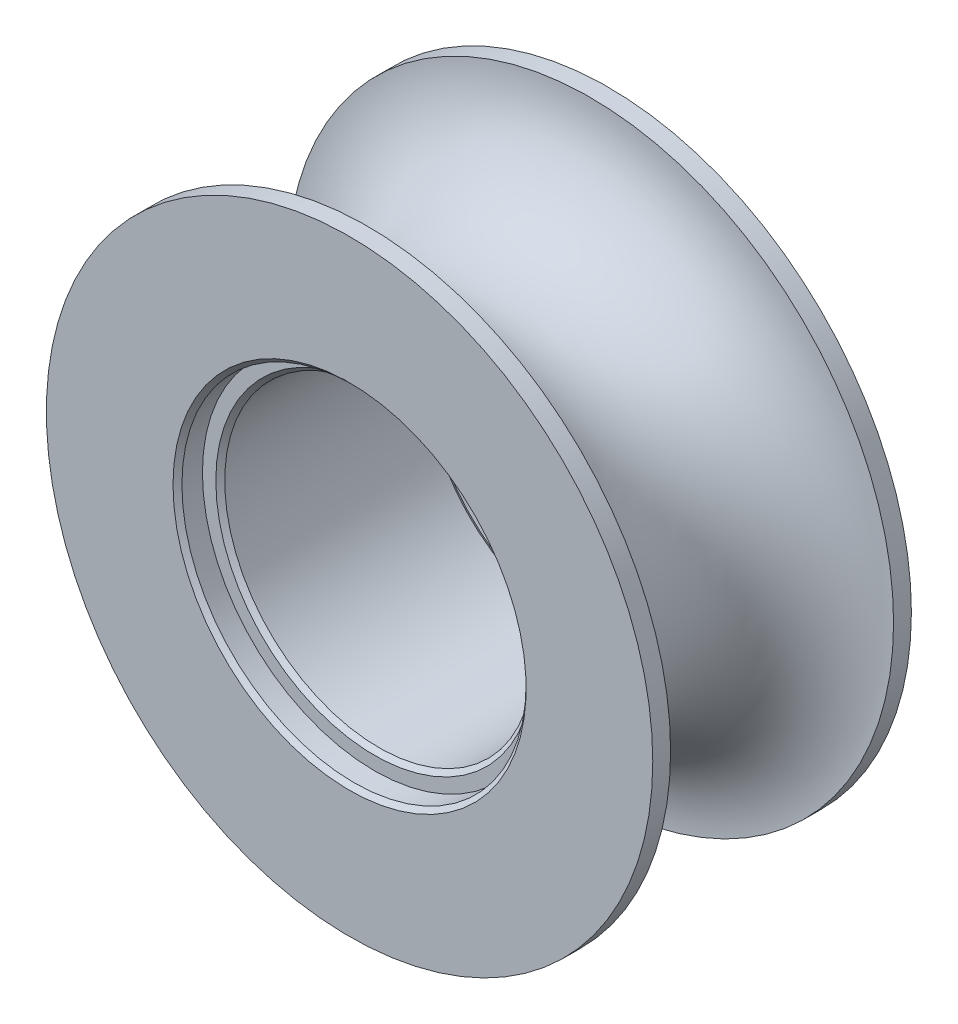
ISO-10303-21;
HEADER;
FILE_DESCRIPTION(('STEP AP214'),'2;1');
FILE_NAME('part.step','',(''),(''),'','','');
FILE_SCHEMA(('AUTOMOTIVE_DESIGN { 1 0 10303 214 1 1 1 1 }'));
ENDSEC;
DATA;
#1=APPLICATION_CONTEXT('core data for automotive mechanical design processes');
#2=APPLICATION_PROTOCOL_DEFINITION('international standard','automotive_design',2000,#1);
#3=PRODUCT_CONTEXT('',#1,'mechanical');
#4=PRODUCT('Part','Part','',(#3));
#5=PRODUCT_RELATED_PRODUCT_CATEGORY('part','',(#4));
#6=PRODUCT_DEFINITION_FORMATION('','',#4);
#7=PRODUCT_DEFINITION_CONTEXT('part definition',#1,'design');
#8=PRODUCT_DEFINITION('design','',#6,#7);
#9=PRODUCT_DEFINITION_SHAPE('','',#8);
#10=(LENGTH_UNIT() NAMED_UNIT(*) SI_UNIT(.MILLI.,.METRE.));
#11=(NAMED_UNIT(*) PLANE_ANGLE_UNIT() SI_UNIT($,.RADIAN.));
#12=(NAMED_UNIT(*) SI_UNIT($,.STERADIAN.) SOLID_ANGLE_UNIT());
#13=UNCERTAINTY_MEASURE_WITH_UNIT(LENGTH_MEASURE(1.E-05),#10,'distance_accuracy_value','');
#14=(GEOMETRIC_REPRESENTATION_CONTEXT(3) GLOBAL_UNCERTAINTY_ASSIGNED_CONTEXT((#13)) GLOBAL_UNIT_ASSIGNED_CONTEXT((#10,
#11,#12)) REPRESENTATION_CONTEXT('',''));
#15=CARTESIAN_POINT('',(0.,0.,0.));
#16=DIRECTION('',(0.,0.,1.));
#17=DIRECTION('',(1.,0.,0.));
#18=AXIS2_PLACEMENT_3D('',#15,#16,#17);
#19=CARTESIAN_POINT('',(0.,0.,64.9809529823271));
#20=DIRECTION('',(0.,0.,1.));
#21=DIRECTION('',(1.,0.,0.));
#22=AXIS2_PLACEMENT_3D('',#19,#20,#21);
#23=CYLINDRICAL_SURFACE('',#22,8.65);
#24=CARTESIAN_POINT('',(0.,0.,5.59999999999999));
#25=DIRECTION('',(0.,0.,1.));
#26=DIRECTION('',(1.,0.,0.));
#27=AXIS2_PLACEMENT_3D('',#24,#25,#26);
#28=CIRCLE('',#27,8.65);
#29=CARTESIAN_POINT('',(8.65,0.,5.59999999999999));
#30=VERTEX_POINT('',#29);
#31=EDGE_CURVE('E58',#30,#30,#28,.T.);
#32=ORIENTED_EDGE('',*,*,#31,.T.);
#33=EDGE_LOOP('',(#32));
#34=FACE_BOUND('',#33,.T.);
#35=CARTESIAN_POINT('',(0.,0.,-5.60000000000001));
#36=DIRECTION('',(0.,0.,-1.));
#37=DIRECTION('',(-1.,0.,0.));
#38=AXIS2_PLACEMENT_3D('',#35,#36,#37);
#39=CIRCLE('',#38,8.65);
#40=CARTESIAN_POINT('',(-8.65,0.,-5.60000000000001));
#41=VERTEX_POINT('',#40);
#42=EDGE_CURVE('E64',#41,#41,#39,.T.);
#43=ORIENTED_EDGE('',*,*,#42,.T.);
#44=EDGE_LOOP('',(#43));
#45=FACE_BOUND('',#44,.T.);
#46=ADVANCED_FACE('F39',(#34,#45),#23,.F.);
#47=CARTESIAN_POINT('',(0.,0.,0.));
#48=DIRECTION('',(0.,0.,1.));
#49=DIRECTION('',(1.,0.,0.));
#50=AXIS2_PLACEMENT_3D('',#47,#48,#49);
#51=TOROIDAL_SURFACE('',#50,17.,6.25);
#52=CARTESIAN_POINT('',(0.,0.,6.24999999999999));
#53=DIRECTION('',(0.,0.,1.));
#54=DIRECTION('',(1.,0.,0.));
#55=AXIS2_PLACEMENT_3D('',#52,#53,#54);
#56=CIRCLE('',#55,17.);
#57=CARTESIAN_POINT('',(17.,0.,6.24999999999999));
#58=VERTEX_POINT('',#57);
#59=EDGE_CURVE('E80',#58,#58,#56,.T.);
#60=ORIENTED_EDGE('',*,*,#59,.F.);
#61=EDGE_LOOP('',(#60));
#62=FACE_BOUND('',#61,.T.);
#63=CARTESIAN_POINT('',(0.,0.,-6.25000000000001));
#64=DIRECTION('',(0.,0.,1.));
#65=DIRECTION('',(1.,0.,0.));
#66=AXIS2_PLACEMENT_3D('',#63,#64,#65);
#67=CIRCLE('',#66,17.);
#68=CARTESIAN_POINT('',(17.,0.,-6.25000000000001));
#69=VERTEX_POINT('',#68);
#70=EDGE_CURVE('E92',#69,#69,#67,.T.);
#71=ORIENTED_EDGE('',*,*,#70,.T.);
#72=EDGE_LOOP('',(#71));
#73=FACE_BOUND('',#72,.T.);
#74=ADVANCED_FACE('F124',(#62,#73),#51,.F.);
#75=CARTESIAN_POINT('',(0.,0.,64.9809529823271));
#76=DIRECTION('',(0.,0.,1.));
#77=DIRECTION('',(1.,0.,0.));
#78=AXIS2_PLACEMENT_3D('',#75,#76,#77);
#79=CYLINDRICAL_SURFACE('',#78,17.);
#80=CARTESIAN_POINT('',(0.,0.,7.24999999999999));
#81=DIRECTION('',(0.,0.,1.));
#82=DIRECTION('',(1.,0.,0.));
#83=AXIS2_PLACEMENT_3D('',#80,#81,#82);
#84=CIRCLE('',#83,17.);
#85=CARTESIAN_POINT('',(17.,0.,7.24999999999999));
#86=VERTEX_POINT('',#85);
#87=EDGE_CURVE('E84',#86,#86,#84,.T.);
#88=ORIENTED_EDGE('',*,*,#87,.F.);
#89=EDGE_LOOP('',(#88));
#90=FACE_BOUND('',#89,.T.);
#91=ORIENTED_EDGE('',*,*,#59,.T.);
#92=EDGE_LOOP('',(#91));
#93=FACE_BOUND('',#92,.T.);
#94=ADVANCED_FACE('F130',(#90,#93),#79,.T.);
#95=CARTESIAN_POINT('',(0.,17.,7.24999999999999));
#96=DIRECTION('',(0.,0.,-1.));
#97=DIRECTION('',(-1.,0.,0.));
#98=AXIS2_PLACEMENT_3D('',#95,#96,#97);
#99=PLANE('',#98);
#100=CARTESIAN_POINT('',(0.,0.,7.24999999999999));
#101=DIRECTION('',(0.,0.,-1.));
#102=DIRECTION('',(-1.,0.,0.));
#103=AXIS2_PLACEMENT_3D('',#100,#101,#102);
#104=CIRCLE('',#103,9.90000000000001);
#105=CARTESIAN_POINT('',(-9.90000000000001,0.,7.24999999999999));
#106=VERTEX_POINT('',#105);
#107=EDGE_CURVE('E72',#106,#106,#104,.T.);
#108=ORIENTED_EDGE('',*,*,#107,.T.);
#109=EDGE_LOOP('',(#108));
#110=FACE_BOUND('',#109,.T.);
#111=ORIENTED_EDGE('',*,*,#87,.T.);
#112=EDGE_LOOP('',(#111));
#113=FACE_BOUND('',#112,.T.);
#114=ADVANCED_FACE('F138',(#110,#113),#99,.F.);
#115=CARTESIAN_POINT('',(0.,17.,-7.25000000000001));
#116=DIRECTION('',(0.,0.,1.));
#117=DIRECTION('',(1.,0.,0.));
#118=AXIS2_PLACEMENT_3D('',#115,#116,#117);
#119=PLANE('',#118);
#120=CARTESIAN_POINT('',(0.,0.,-7.25000000000001));
#121=DIRECTION('',(0.,0.,1.));
#122=DIRECTION('',(1.,0.,0.));
#123=AXIS2_PLACEMENT_3D('',#120,#121,#122);
#124=CIRCLE('',#123,9.90000000000001);
#125=CARTESIAN_POINT('',(9.90000000000001,0.,-7.25000000000001));
#126=VERTEX_POINT('',#125);
#127=EDGE_CURVE('E48',#126,#126,#124,.T.);
#128=ORIENTED_EDGE('',*,*,#127,.T.);
#129=EDGE_LOOP('',(#128));
#130=FACE_BOUND('',#129,.T.);
#131=CARTESIAN_POINT('',(0.,0.,-7.25000000000001));
#132=DIRECTION('',(0.,0.,1.));
#133=DIRECTION('',(1.,0.,0.));
#134=AXIS2_PLACEMENT_3D('',#131,#132,#133);
#135=CIRCLE('',#134,17.);
#136=CARTESIAN_POINT('',(17.,0.,-7.25000000000001));
#137=VERTEX_POINT('',#136);
#138=EDGE_CURVE('E88',#137,#137,#135,.T.);
#139=ORIENTED_EDGE('',*,*,#138,.F.);
#140=EDGE_LOOP('',(#139));
#141=FACE_BOUND('',#140,.T.);
#142=ADVANCED_FACE('F136',(#130,#141),#119,.F.);
#143=CARTESIAN_POINT('',(0.,0.,64.9809529823271));
#144=DIRECTION('',(0.,0.,1.));
#145=DIRECTION('',(1.,0.,0.));
#146=AXIS2_PLACEMENT_3D('',#143,#144,#145);
#147=CYLINDRICAL_SURFACE('',#146,17.);
#148=ORIENTED_EDGE('',*,*,#70,.F.);
#149=EDGE_LOOP('',(#148));
#150=FACE_BOUND('',#149,.T.);
#151=ORIENTED_EDGE('',*,*,#138,.T.);
#152=EDGE_LOOP('',(#151));
#153=FACE_BOUND('',#152,.T.);
#154=ADVANCED_FACE('F173',(#150,#153),#147,.T.);
#155=CARTESIAN_POINT('',(0.,0.,-5.85));
#156=DIRECTION('',(0.,0.,-1.));
#157=DIRECTION('',(-1.,0.,0.));
#158=AXIS2_PLACEMENT_3D('',#155,#156,#157);
#159=PLANE('',#158);
#160=CARTESIAN_POINT('',(0.,0.,-5.85));
#161=DIRECTION('',(0.,0.,-1.));
#162=DIRECTION('',(-1.,0.,0.));
#163=AXIS2_PLACEMENT_3D('',#160,#161,#162);
#164=CIRCLE('',#163,8.89999999999999);
#165=CARTESIAN_POINT('',(-8.89999999999999,0.,-5.85));
#166=VERTEX_POINT('',#165);
#167=EDGE_CURVE('E10',#166,#166,#164,.F.);
#168=ORIENTED_EDGE('',*,*,#167,.T.);
#169=EDGE_LOOP('',(#168));
#170=FACE_BOUND('',#169,.T.);
#171=CARTESIAN_POINT('',(0.,0.,-5.85));
#172=DIRECTION('',(0.,0.,-1.));
#173=DIRECTION('',(-1.,0.,0.));
#174=AXIS2_PLACEMENT_3D('',#171,#172,#173);
#175=CIRCLE('',#174,9.65);
#176=CARTESIAN_POINT('',(-9.65,0.,-5.85));
#177=VERTEX_POINT('',#176);
#178=EDGE_CURVE('E96',#177,#177,#175,.T.);
#179=ORIENTED_EDGE('',*,*,#178,.T.);
#180=EDGE_LOOP('',(#179));
#181=FACE_BOUND('',#180,.T.);
#182=ADVANCED_FACE('F168',(#170,#181),#159,.T.);
#183=CARTESIAN_POINT('',(0.,0.,-5.85));
#184=DIRECTION('',(0.,0.,-1.));
#185=DIRECTION('',(-1.,0.,0.));
#186=AXIS2_PLACEMENT_3D('',#183,#184,#185);
#187=CYLINDRICAL_SURFACE('',#186,9.65);
#188=CARTESIAN_POINT('',(0.,0.,-6.99999999999999));
#189=DIRECTION('',(0.,0.,1.));
#190=DIRECTION('',(1.,0.,0.));
#191=AXIS2_PLACEMENT_3D('',#188,#189,#190);
#192=CIRCLE('',#191,9.65);
#193=CARTESIAN_POINT('',(9.65,0.,-6.99999999999999));
#194=VERTEX_POINT('',#193);
#195=EDGE_CURVE('E53',#194,#194,#192,.F.);
#196=ORIENTED_EDGE('',*,*,#195,.T.);
#197=EDGE_LOOP('',(#196));
#198=FACE_BOUND('',#197,.T.);
#199=ORIENTED_EDGE('',*,*,#178,.F.);
#200=EDGE_LOOP('',(#199));
#201=FACE_BOUND('',#200,.T.);
#202=ADVANCED_FACE('F119',(#198,#201),#187,.F.);
#203=CARTESIAN_POINT('',(0.,0.,5.84999999999999));
#204=DIRECTION('',(0.,0.,1.));
#205=DIRECTION('',(1.,0.,0.));
#206=AXIS2_PLACEMENT_3D('',#203,#204,#205);
#207=PLANE('',#206);
#208=CARTESIAN_POINT('',(0.,0.,5.84999999999999));
#209=DIRECTION('',(0.,0.,1.));
#210=DIRECTION('',(1.,0.,0.));
#211=AXIS2_PLACEMENT_3D('',#208,#209,#210);
#212=CIRCLE('',#211,8.9);
#213=CARTESIAN_POINT('',(8.9,0.,5.84999999999999));
#214=VERTEX_POINT('',#213);
#215=EDGE_CURVE('E68',#214,#214,#212,.F.);
#216=ORIENTED_EDGE('',*,*,#215,.T.);
#217=EDGE_LOOP('',(#216));
#218=FACE_BOUND('',#217,.T.);
#219=CARTESIAN_POINT('',(0.,0.,5.84999999999999));
#220=DIRECTION('',(0.,0.,1.));
#221=DIRECTION('',(1.,0.,0.));
#222=AXIS2_PLACEMENT_3D('',#219,#220,#221);
#223=CIRCLE('',#222,9.65);
#224=CARTESIAN_POINT('',(9.65,0.,5.84999999999999));
#225=VERTEX_POINT('',#224);
#226=EDGE_CURVE('E100',#225,#225,#223,.T.);
#227=ORIENTED_EDGE('',*,*,#226,.T.);
#228=EDGE_LOOP('',(#227));
#229=FACE_BOUND('',#228,.T.);
#230=ADVANCED_FACE('F105',(#218,#229),#207,.T.);
#231=CARTESIAN_POINT('',(0.,0.,5.84999999999999));
#232=DIRECTION('',(0.,0.,1.));
#233=DIRECTION('',(1.,0.,0.));
#234=AXIS2_PLACEMENT_3D('',#231,#232,#233);
#235=CYLINDRICAL_SURFACE('',#234,9.65);
#236=CARTESIAN_POINT('',(0.,0.,6.99999999999998));
#237=DIRECTION('',(0.,0.,-1.));
#238=DIRECTION('',(-1.,0.,0.));
#239=AXIS2_PLACEMENT_3D('',#236,#237,#238);
#240=CIRCLE('',#239,9.65);
#241=CARTESIAN_POINT('',(-9.65,0.,6.99999999999998));
#242=VERTEX_POINT('',#241);
#243=EDGE_CURVE('E76',#242,#242,#240,.F.);
#244=ORIENTED_EDGE('',*,*,#243,.T.);
#245=EDGE_LOOP('',(#244));
#246=FACE_BOUND('',#245,.T.);
#247=ORIENTED_EDGE('',*,*,#226,.F.);
#248=EDGE_LOOP('',(#247));
#249=FACE_BOUND('',#248,.T.);
#250=ADVANCED_FACE('F107',(#246,#249),#235,.F.);
#251=CARTESIAN_POINT('',(0.,0.,6.99999999999998));
#252=DIRECTION('',(0.,0.,1.));
#253=DIRECTION('',(1.,0.,0.));
#254=AXIS2_PLACEMENT_3D('',#251,#252,#253);
#255=CONICAL_SURFACE('',#254,9.65,0.785398163397438);
#256=ORIENTED_EDGE('',*,*,#107,.F.);
#257=EDGE_LOOP('',(#256));
#258=FACE_BOUND('',#257,.T.);
#259=ORIENTED_EDGE('',*,*,#243,.F.);
#260=EDGE_LOOP('',(#259));
#261=FACE_BOUND('',#260,.T.);
#262=ADVANCED_FACE('F109',(#258,#261),#255,.F.);
#263=CARTESIAN_POINT('',(0.,0.,5.84999999999999));
#264=DIRECTION('',(0.,0.,1.));
#265=DIRECTION('',(1.,0.,0.));
#266=AXIS2_PLACEMENT_3D('',#263,#264,#265);
#267=CONICAL_SURFACE('',#266,8.9,0.785398163397438);
#268=ORIENTED_EDGE('',*,*,#31,.F.);
#269=EDGE_LOOP('',(#268));
#270=FACE_BOUND('',#269,.T.);
#271=ORIENTED_EDGE('',*,*,#215,.F.);
#272=EDGE_LOOP('',(#271));
#273=FACE_BOUND('',#272,.T.);
#274=ADVANCED_FACE('F116',(#270,#273),#267,.F.);
#275=CARTESIAN_POINT('',(0.,0.,-6.99999999999999));
#276=DIRECTION('',(0.,0.,-1.));
#277=DIRECTION('',(-1.,0.,0.));
#278=AXIS2_PLACEMENT_3D('',#275,#276,#277);
#279=CONICAL_SURFACE('',#278,9.65,0.785398163397438);
#280=ORIENTED_EDGE('',*,*,#127,.F.);
#281=EDGE_LOOP('',(#280));
#282=FACE_BOUND('',#281,.T.);
#283=ORIENTED_EDGE('',*,*,#195,.F.);
#284=EDGE_LOOP('',(#283));
#285=FACE_BOUND('',#284,.T.);
#286=ADVANCED_FACE('F153',(#282,#285),#279,.F.);
#287=CARTESIAN_POINT('',(0.,0.,-5.85000000000001));
#288=DIRECTION('',(0.,0.,-1.));
#289=DIRECTION('',(-1.,0.,0.));
#290=AXIS2_PLACEMENT_3D('',#287,#288,#289);
#291=CONICAL_SURFACE('',#290,8.9,0.785398163397438);
#292=ORIENTED_EDGE('',*,*,#42,.F.);
#293=EDGE_LOOP('',(#292));
#294=FACE_BOUND('',#293,.T.);
#295=ORIENTED_EDGE('',*,*,#167,.F.);
#296=EDGE_LOOP('',(#295));
#297=FACE_BOUND('',#296,.T.);
#298=ADVANCED_FACE('F42',(#294,#297),#291,.F.);
#299=CLOSED_SHELL('',(#46,#74,#94,#114,#142,#154,#182,#202,#230,#250,#262,#274,#286,#298));
#300=MANIFOLD_SOLID_BREP('B2',#299);
#301=ADVANCED_BREP_SHAPE_REPRESENTATION('',(#18,#300),#14);
#302=SHAPE_DEFINITION_REPRESENTATION(#9,#301);
ENDSEC;
END-ISO-10303-21;
